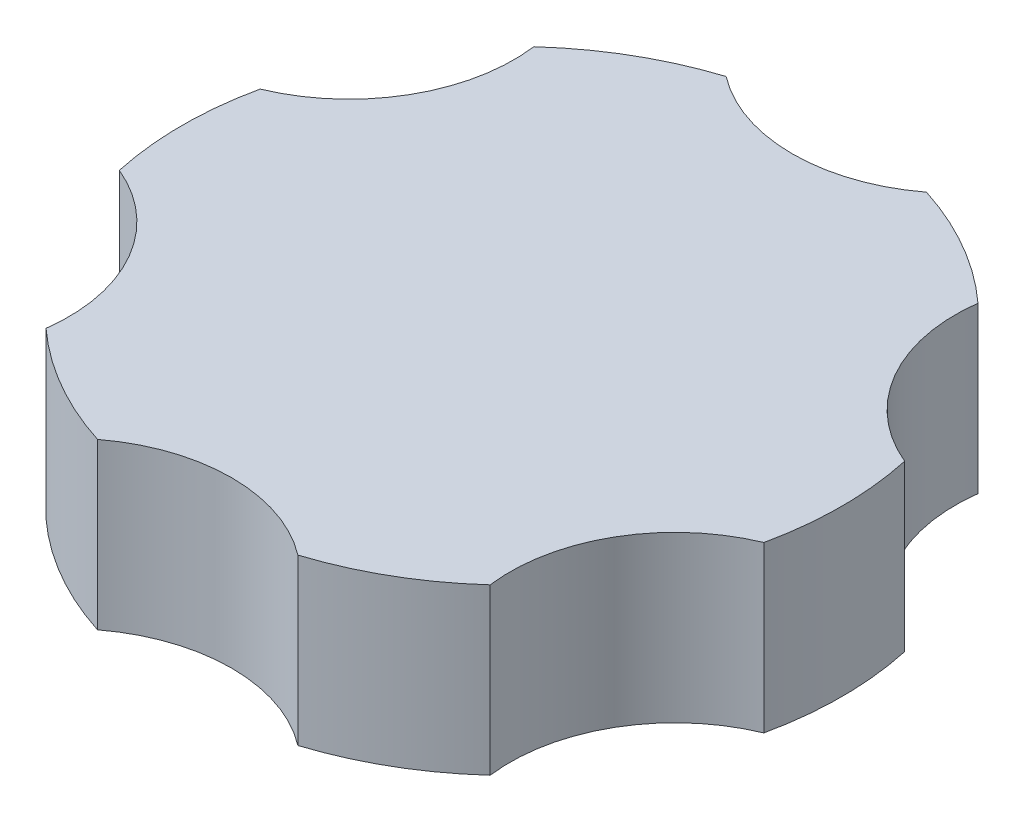
ISO-10303-21;
HEADER;
FILE_DESCRIPTION(('STEP AP214'),'2;1');
FILE_NAME('part.step','',(''),(''),'','','');
FILE_SCHEMA(('AUTOMOTIVE_DESIGN { 1 0 10303 214 1 1 1 1 }'));
ENDSEC;
DATA;
#1=APPLICATION_CONTEXT('core data for automotive mechanical design processes');
#2=APPLICATION_PROTOCOL_DEFINITION('international standard','automotive_design',2000,#1);
#3=PRODUCT_CONTEXT('',#1,'mechanical');
#4=PRODUCT('Part','Part','',(#3));
#5=PRODUCT_RELATED_PRODUCT_CATEGORY('part','',(#4));
#6=PRODUCT_DEFINITION_FORMATION('','',#4);
#7=PRODUCT_DEFINITION_CONTEXT('part definition',#1,'design');
#8=PRODUCT_DEFINITION('design','',#6,#7);
#9=PRODUCT_DEFINITION_SHAPE('','',#8);
#10=(LENGTH_UNIT() NAMED_UNIT(*) SI_UNIT(.MILLI.,.METRE.));
#11=(NAMED_UNIT(*) PLANE_ANGLE_UNIT() SI_UNIT($,.RADIAN.));
#12=(NAMED_UNIT(*) SI_UNIT($,.STERADIAN.) SOLID_ANGLE_UNIT());
#13=UNCERTAINTY_MEASURE_WITH_UNIT(LENGTH_MEASURE(1.E-05),#10,'distance_accuracy_value','');
#14=(GEOMETRIC_REPRESENTATION_CONTEXT(3) GLOBAL_UNCERTAINTY_ASSIGNED_CONTEXT((#13)) GLOBAL_UNIT_ASSIGNED_CONTEXT((#10,
#11,#12)) REPRESENTATION_CONTEXT('',''));
#15=CARTESIAN_POINT('',(0.,0.,0.));
#16=DIRECTION('',(0.,0.,1.));
#17=DIRECTION('',(1.,0.,0.));
#18=AXIS2_PLACEMENT_3D('',#15,#16,#17);
#19=CARTESIAN_POINT('',(0.,10.,0.));
#20=DIRECTION('',(0.,-1.,0.));
#21=DIRECTION('',(0.,0.,-1.));
#22=AXIS2_PLACEMENT_3D('',#19,#20,#21);
#23=CYLINDRICAL_SURFACE('',#22,20.);
#24=CARTESIAN_POINT('',(0.,0.,0.));
#25=DIRECTION('',(0.,1.,0.));
#26=DIRECTION('',(0.,0.,1.));
#27=AXIS2_PLACEMENT_3D('',#24,#25,#26);
#28=CIRCLE('',#27,20.);
#29=CARTESIAN_POINT('',(-19.5392793427599,0.,-4.26808654616994));
#30=VERTEX_POINT('',#29);
#31=CARTESIAN_POINT('',(-19.5392793427599,0.,4.26808654617008));
#32=VERTEX_POINT('',#31);
#33=EDGE_CURVE('E269',#30,#32,#28,.T.);
#34=ORIENTED_EDGE('',*,*,#33,.T.);
#35=DIRECTION('',(0.,1.,0.));
#36=VECTOR('',#35,1.);
#37=CARTESIAN_POINT('',(-19.5392793427599,5.,4.26808654617008));
#38=LINE('',#37,#36);
#39=CARTESIAN_POINT('',(-19.5392793427599,10.,4.26808654617008));
#40=VERTEX_POINT('',#39);
#41=EDGE_CURVE('E247',#32,#40,#38,.T.);
#42=ORIENTED_EDGE('',*,*,#41,.T.);
#43=CARTESIAN_POINT('',(0.,10.,0.));
#44=DIRECTION('',(0.,1.,0.));
#45=DIRECTION('',(0.,0.,1.));
#46=AXIS2_PLACEMENT_3D('',#43,#44,#45);
#47=CIRCLE('',#46,20.);
#48=CARTESIAN_POINT('',(-19.5392793427599,10.,-4.26808654616994));
#49=VERTEX_POINT('',#48);
#50=EDGE_CURVE('E264',#49,#40,#47,.T.);
#51=ORIENTED_EDGE('',*,*,#50,.F.);
#52=DIRECTION('',(0.,1.,0.));
#53=VECTOR('',#52,1.);
#54=CARTESIAN_POINT('',(-19.5392793427599,5.,-4.26808654616994));
#55=LINE('',#54,#53);
#56=EDGE_CURVE('E222',#49,#30,#55,.F.);
#57=ORIENTED_EDGE('',*,*,#56,.T.);
#58=EDGE_LOOP('',(#34,#42,#51,#57));
#59=FACE_BOUND('',#58,.T.);
#60=ADVANCED_FACE('F33',(#59),#23,.T.);
#61=CARTESIAN_POINT('',(-13.4659110459137,10.,14.7874690093856));
#62=VERTEX_POINT('',#61);
#63=CARTESIAN_POINT('',(-6.07336829684614,10.,19.0555555555555));
#64=VERTEX_POINT('',#63);
#65=EDGE_CURVE('E322',#62,#64,#47,.T.);
#66=ORIENTED_EDGE('',*,*,#65,.F.);
#67=DIRECTION('',(0.,1.,0.));
#68=VECTOR('',#67,1.);
#69=CARTESIAN_POINT('',(-13.4659110459137,5.,14.7874690093856));
#70=LINE('',#69,#68);
#71=CARTESIAN_POINT('',(-13.4659110459137,0.,14.7874690093856));
#72=VERTEX_POINT('',#71);
#73=EDGE_CURVE('E244',#62,#72,#70,.F.);
#74=ORIENTED_EDGE('',*,*,#73,.T.);
#75=CARTESIAN_POINT('',(-6.07336829684614,0.,19.0555555555556));
#76=VERTEX_POINT('',#75);
#77=EDGE_CURVE('E285',#72,#76,#28,.T.);
#78=ORIENTED_EDGE('',*,*,#77,.T.);
#79=DIRECTION('',(0.,1.,0.));
#80=VECTOR('',#79,1.);
#81=CARTESIAN_POINT('',(-6.07336829684614,5.,19.0555555555555));
#82=LINE('',#81,#80);
#83=EDGE_CURVE('E241',#76,#64,#82,.T.);
#84=ORIENTED_EDGE('',*,*,#83,.T.);
#85=EDGE_LOOP('',(#66,#74,#78,#84));
#86=FACE_BOUND('',#85,.T.);
#87=ADVANCED_FACE('F291',(#86),#23,.T.);
#88=CARTESIAN_POINT('',(6.07336829684614,10.,19.0555555555555));
#89=VERTEX_POINT('',#88);
#90=CARTESIAN_POINT('',(13.4659110459139,10.,14.7874690093854));
#91=VERTEX_POINT('',#90);
#92=EDGE_CURVE('E318',#89,#91,#47,.T.);
#93=ORIENTED_EDGE('',*,*,#92,.F.);
#94=DIRECTION('',(0.,1.,0.));
#95=VECTOR('',#94,1.);
#96=CARTESIAN_POINT('',(6.07336829684614,5.,19.0555555555555));
#97=LINE('',#96,#95);
#98=CARTESIAN_POINT('',(6.07336829684614,0.,19.0555555555555));
#99=VERTEX_POINT('',#98);
#100=EDGE_CURVE('E238',#89,#99,#97,.F.);
#101=ORIENTED_EDGE('',*,*,#100,.T.);
#102=CARTESIAN_POINT('',(13.4659110459139,0.,14.7874690093854));
#103=VERTEX_POINT('',#102);
#104=EDGE_CURVE('E287',#99,#103,#28,.T.);
#105=ORIENTED_EDGE('',*,*,#104,.T.);
#106=DIRECTION('',(0.,1.,0.));
#107=VECTOR('',#106,1.);
#108=CARTESIAN_POINT('',(13.4659110459139,5.,14.7874690093854));
#109=LINE('',#108,#107);
#110=EDGE_CURVE('E235',#103,#91,#109,.T.);
#111=ORIENTED_EDGE('',*,*,#110,.T.);
#112=EDGE_LOOP('',(#93,#101,#105,#111));
#113=FACE_BOUND('',#112,.T.);
#114=ADVANCED_FACE('F345',(#113),#23,.T.);
#115=CARTESIAN_POINT('',(19.5392793427599,10.,4.2680865461698));
#116=VERTEX_POINT('',#115);
#117=CARTESIAN_POINT('',(19.5392793427598,10.,-4.26808654617021));
#118=VERTEX_POINT('',#117);
#119=EDGE_CURVE('E317',#116,#118,#47,.T.);
#120=ORIENTED_EDGE('',*,*,#119,.F.);
#121=DIRECTION('',(0.,1.,0.));
#122=VECTOR('',#121,1.);
#123=CARTESIAN_POINT('',(19.5392793427599,5.,4.2680865461698));
#124=LINE('',#123,#122);
#125=CARTESIAN_POINT('',(19.5392793427599,0.,4.2680865461698));
#126=VERTEX_POINT('',#125);
#127=EDGE_CURVE('E232',#116,#126,#124,.F.);
#128=ORIENTED_EDGE('',*,*,#127,.T.);
#129=CARTESIAN_POINT('',(19.5392793427598,0.,-4.26808654617022));
#130=VERTEX_POINT('',#129);
#131=EDGE_CURVE('E294',#126,#130,#28,.T.);
#132=ORIENTED_EDGE('',*,*,#131,.T.);
#133=DIRECTION('',(0.,1.,0.));
#134=VECTOR('',#133,1.);
#135=CARTESIAN_POINT('',(19.5392793427598,5.,-4.26808654617021));
#136=LINE('',#135,#134);
#137=EDGE_CURVE('E56',#130,#118,#136,.T.);
#138=ORIENTED_EDGE('',*,*,#137,.T.);
#139=EDGE_LOOP('',(#120,#128,#132,#138));
#140=FACE_BOUND('',#139,.T.);
#141=ADVANCED_FACE('F352',(#140),#23,.T.);
#142=CARTESIAN_POINT('',(-6.07336829684614,0.,-19.0555555555555));
#143=VERTEX_POINT('',#142);
#144=CARTESIAN_POINT('',(-13.4659110459138,0.,-14.7874690093855));
#145=VERTEX_POINT('',#144);
#146=EDGE_CURVE('E266',#143,#145,#28,.T.);
#147=ORIENTED_EDGE('',*,*,#146,.T.);
#148=DIRECTION('',(0.,1.,0.));
#149=VECTOR('',#148,1.);
#150=CARTESIAN_POINT('',(-13.4659110459138,5.,-14.7874690093855));
#151=LINE('',#150,#149);
#152=CARTESIAN_POINT('',(-13.4659110459138,10.,-14.7874690093855));
#153=VERTEX_POINT('',#152);
#154=EDGE_CURVE('E225',#145,#153,#151,.T.);
#155=ORIENTED_EDGE('',*,*,#154,.T.);
#156=CARTESIAN_POINT('',(-6.07336829684614,10.,-19.0555555555555));
#157=VERTEX_POINT('',#156);
#158=EDGE_CURVE('E260',#157,#153,#47,.T.);
#159=ORIENTED_EDGE('',*,*,#158,.F.);
#160=DIRECTION('',(0.,1.,0.));
#161=VECTOR('',#160,1.);
#162=CARTESIAN_POINT('',(-6.07336829684614,5.,-19.0555555555555));
#163=LINE('',#162,#161);
#164=EDGE_CURVE('E253',#157,#143,#163,.F.);
#165=ORIENTED_EDGE('',*,*,#164,.T.);
#166=EDGE_LOOP('',(#147,#155,#159,#165));
#167=FACE_BOUND('',#166,.T.);
#168=ADVANCED_FACE('F309',(#167),#23,.T.);
#169=CARTESIAN_POINT('',(13.4659110459136,10.,-14.7874690093857));
#170=VERTEX_POINT('',#169);
#171=CARTESIAN_POINT('',(6.07336829684614,10.,-19.0555555555555));
#172=VERTEX_POINT('',#171);
#173=EDGE_CURVE('E265',#170,#172,#47,.T.);
#174=ORIENTED_EDGE('',*,*,#173,.F.);
#175=DIRECTION('',(0.,1.,0.));
#176=VECTOR('',#175,1.);
#177=CARTESIAN_POINT('',(13.4659110459136,5.,-14.7874690093857));
#178=LINE('',#177,#176);
#179=CARTESIAN_POINT('',(13.4659110459136,0.,-14.7874690093857));
#180=VERTEX_POINT('',#179);
#181=EDGE_CURVE('E228',#170,#180,#178,.F.);
#182=ORIENTED_EDGE('',*,*,#181,.T.);
#183=CARTESIAN_POINT('',(6.07336829684614,0.,-19.0555555555556));
#184=VERTEX_POINT('',#183);
#185=EDGE_CURVE('E259',#180,#184,#28,.T.);
#186=ORIENTED_EDGE('',*,*,#185,.T.);
#187=DIRECTION('',(0.,1.,0.));
#188=VECTOR('',#187,1.);
#189=CARTESIAN_POINT('',(6.07336829684614,5.,-19.0555555555555));
#190=LINE('',#189,#188);
#191=EDGE_CURVE('E256',#184,#172,#190,.T.);
#192=ORIENTED_EDGE('',*,*,#191,.T.);
#193=EDGE_LOOP('',(#174,#182,#186,#192));
#194=FACE_BOUND('',#193,.T.);
#195=ADVANCED_FACE('F35',(#194),#23,.T.);
#196=CARTESIAN_POINT('',(0.,10.,0.));
#197=DIRECTION('',(0.,1.,0.));
#198=DIRECTION('',(0.,0.,1.));
#199=AXIS2_PLACEMENT_3D('',#196,#197,#198);
#200=PLANE('',#199);
#201=CARTESIAN_POINT('',(-23.3826859021798,10.,13.5000000000001));
#202=DIRECTION('',(0.,1.,0.));
#203=DIRECTION('',(0.866025403784436,0.,-0.500000000000004));
#204=AXIS2_PLACEMENT_3D('',#201,#202,#203);
#205=CIRCLE('',#204,10.);
#206=EDGE_CURVE('E213',#62,#40,#205,.T.);
#207=ORIENTED_EDGE('',*,*,#206,.F.);
#208=ORIENTED_EDGE('',*,*,#65,.T.);
#209=CARTESIAN_POINT('',(0.,10.,27.));
#210=DIRECTION('',(0.,1.,0.));
#211=DIRECTION('',(0.,0.,-1.));
#212=AXIS2_PLACEMENT_3D('',#209,#210,#211);
#213=CIRCLE('',#212,10.);
#214=EDGE_CURVE('E216',#89,#64,#213,.T.);
#215=ORIENTED_EDGE('',*,*,#214,.F.);
#216=ORIENTED_EDGE('',*,*,#92,.T.);
#217=CARTESIAN_POINT('',(23.38268590218,10.,13.4999999999998));
#218=DIRECTION('',(0.,1.,0.));
#219=DIRECTION('',(-0.866025403784443,0.,-0.499999999999992));
#220=AXIS2_PLACEMENT_3D('',#217,#218,#219);
#221=CIRCLE('',#220,10.);
#222=EDGE_CURVE('E218',#116,#91,#221,.T.);
#223=ORIENTED_EDGE('',*,*,#222,.F.);
#224=ORIENTED_EDGE('',*,*,#119,.T.);
#225=CARTESIAN_POINT('',(23.3826859021797,10.,-13.5000000000003));
#226=DIRECTION('',(0.,1.,0.));
#227=DIRECTION('',(-0.866025403784433,0.,0.50000000000001));
#228=AXIS2_PLACEMENT_3D('',#225,#226,#227);
#229=CIRCLE('',#228,10.);
#230=EDGE_CURVE('E205',#170,#118,#229,.T.);
#231=ORIENTED_EDGE('',*,*,#230,.F.);
#232=ORIENTED_EDGE('',*,*,#173,.T.);
#233=CARTESIAN_POINT('',(0.,10.,-27.));
#234=DIRECTION('',(0.,1.,0.));
#235=DIRECTION('',(0.,0.,1.));
#236=AXIS2_PLACEMENT_3D('',#233,#234,#235);
#237=CIRCLE('',#236,10.);
#238=EDGE_CURVE('E250',#157,#172,#237,.T.);
#239=ORIENTED_EDGE('',*,*,#238,.F.);
#240=ORIENTED_EDGE('',*,*,#158,.T.);
#241=CARTESIAN_POINT('',(-23.3826859021799,10.,-13.4999999999999));
#242=DIRECTION('',(0.,1.,0.));
#243=DIRECTION('',(0.86602540378444,0.,0.499999999999998));
#244=AXIS2_PLACEMENT_3D('',#241,#242,#243);
#245=CIRCLE('',#244,10.);
#246=EDGE_CURVE('E215',#49,#153,#245,.T.);
#247=ORIENTED_EDGE('',*,*,#246,.F.);
#248=ORIENTED_EDGE('',*,*,#50,.T.);
#249=EDGE_LOOP('',(#207,#208,#215,#216,#223,#224,#231,#232,#239,#240,#247,#248));
#250=FACE_BOUND('',#249,.T.);
#251=ADVANCED_FACE('F313',(#250),#200,.T.);
#252=CARTESIAN_POINT('',(0.,0.,0.));
#253=DIRECTION('',(0.,1.,0.));
#254=DIRECTION('',(0.,0.,1.));
#255=AXIS2_PLACEMENT_3D('',#252,#253,#254);
#256=PLANE('',#255);
#257=DIRECTION('',(-0.866025403784438,0.,-0.5));
#258=VECTOR('',#257,1.);
#259=CARTESIAN_POINT('',(0.,0.,2.));
#260=LINE('',#259,#258);
#261=CARTESIAN_POINT('',(0.,0.,2.));
#262=VERTEX_POINT('',#261);
#263=CARTESIAN_POINT('',(-1.73205080756888,0.,1.));
#264=VERTEX_POINT('',#263);
#265=EDGE_CURVE('E193',#262,#264,#260,.T.);
#266=ORIENTED_EDGE('',*,*,#265,.F.);
#267=DIRECTION('',(-0.866025403784439,0.,0.5));
#268=VECTOR('',#267,1.);
#269=CARTESIAN_POINT('',(1.73205080756888,0.,1.));
#270=LINE('',#269,#268);
#271=CARTESIAN_POINT('',(1.73205080756888,0.,1.));
#272=VERTEX_POINT('',#271);
#273=EDGE_CURVE('E48',#272,#262,#270,.T.);
#274=ORIENTED_EDGE('',*,*,#273,.F.);
#275=DIRECTION('',(0.,0.,1.));
#276=VECTOR('',#275,1.);
#277=CARTESIAN_POINT('',(1.73205080756888,0.,-1.));
#278=LINE('',#277,#276);
#279=CARTESIAN_POINT('',(1.73205080756888,0.,-1.));
#280=VERTEX_POINT('',#279);
#281=EDGE_CURVE('E179',#280,#272,#278,.T.);
#282=ORIENTED_EDGE('',*,*,#281,.F.);
#283=DIRECTION('',(0.866025403784439,0.,0.5));
#284=VECTOR('',#283,1.);
#285=CARTESIAN_POINT('',(0.,0.,-2.));
#286=LINE('',#285,#284);
#287=CARTESIAN_POINT('',(0.,0.,-2.));
#288=VERTEX_POINT('',#287);
#289=EDGE_CURVE('E182',#288,#280,#286,.T.);
#290=ORIENTED_EDGE('',*,*,#289,.F.);
#291=DIRECTION('',(0.866025403784439,0.,-0.5));
#292=VECTOR('',#291,1.);
#293=CARTESIAN_POINT('',(-1.73205080756888,0.,-1.));
#294=LINE('',#293,#292);
#295=CARTESIAN_POINT('',(-1.73205080756888,0.,-1.));
#296=VERTEX_POINT('',#295);
#297=EDGE_CURVE('E198',#296,#288,#294,.T.);
#298=ORIENTED_EDGE('',*,*,#297,.F.);
#299=DIRECTION('',(0.,0.,-1.));
#300=VECTOR('',#299,1.);
#301=CARTESIAN_POINT('',(-1.73205080756888,0.,1.));
#302=LINE('',#301,#300);
#303=EDGE_CURVE('E195',#264,#296,#302,.T.);
#304=ORIENTED_EDGE('',*,*,#303,.F.);
#305=EDGE_LOOP('',(#266,#274,#282,#290,#298,#304));
#306=FACE_BOUND('',#305,.T.);
#307=ORIENTED_EDGE('',*,*,#77,.F.);
#308=CARTESIAN_POINT('',(-23.3826859021798,0.,13.5000000000001));
#309=DIRECTION('',(0.,1.,0.));
#310=DIRECTION('',(0.,0.,1.));
#311=AXIS2_PLACEMENT_3D('',#308,#309,#310);
#312=CIRCLE('',#311,10.);
#313=EDGE_CURVE('E11',#72,#32,#312,.T.);
#314=ORIENTED_EDGE('',*,*,#313,.T.);
#315=ORIENTED_EDGE('',*,*,#33,.F.);
#316=CARTESIAN_POINT('',(-23.3826859021799,0.,-13.4999999999999));
#317=DIRECTION('',(0.,1.,0.));
#318=DIRECTION('',(0.,0.,1.));
#319=AXIS2_PLACEMENT_3D('',#316,#317,#318);
#320=CIRCLE('',#319,10.);
#321=EDGE_CURVE('E272',#30,#145,#320,.T.);
#322=ORIENTED_EDGE('',*,*,#321,.T.);
#323=ORIENTED_EDGE('',*,*,#146,.F.);
#324=CARTESIAN_POINT('',(0.,0.,-27.));
#325=DIRECTION('',(0.,1.,0.));
#326=DIRECTION('',(0.,0.,1.));
#327=AXIS2_PLACEMENT_3D('',#324,#325,#326);
#328=CIRCLE('',#327,10.);
#329=EDGE_CURVE('E263',#143,#184,#328,.T.);
#330=ORIENTED_EDGE('',*,*,#329,.T.);
#331=ORIENTED_EDGE('',*,*,#185,.F.);
#332=CARTESIAN_POINT('',(23.3826859021797,0.,-13.5000000000003));
#333=DIRECTION('',(0.,1.,0.));
#334=DIRECTION('',(0.,0.,1.));
#335=AXIS2_PLACEMENT_3D('',#332,#333,#334);
#336=CIRCLE('',#335,10.);
#337=EDGE_CURVE('E275',#180,#130,#336,.T.);
#338=ORIENTED_EDGE('',*,*,#337,.T.);
#339=ORIENTED_EDGE('',*,*,#131,.F.);
#340=CARTESIAN_POINT('',(23.38268590218,0.,13.4999999999998));
#341=DIRECTION('',(0.,1.,0.));
#342=DIRECTION('',(0.,0.,1.));
#343=AXIS2_PLACEMENT_3D('',#340,#341,#342);
#344=CIRCLE('',#343,10.);
#345=EDGE_CURVE('E277',#126,#103,#344,.T.);
#346=ORIENTED_EDGE('',*,*,#345,.T.);
#347=ORIENTED_EDGE('',*,*,#104,.F.);
#348=CARTESIAN_POINT('',(0.,0.,27.));
#349=DIRECTION('',(0.,1.,0.));
#350=DIRECTION('',(0.,0.,1.));
#351=AXIS2_PLACEMENT_3D('',#348,#349,#350);
#352=CIRCLE('',#351,10.);
#353=EDGE_CURVE('E41',#99,#76,#352,.T.);
#354=ORIENTED_EDGE('',*,*,#353,.T.);
#355=EDGE_LOOP('',(#307,#314,#315,#322,#323,#330,#331,#338,#339,#346,#347,#354));
#356=FACE_BOUND('',#355,.T.);
#357=ADVANCED_FACE('F284',(#306,#356),#256,.F.);
#358=CARTESIAN_POINT('',(0.,0.,-27.));
#359=DIRECTION('',(0.,1.,0.));
#360=DIRECTION('',(0.,0.,1.));
#361=AXIS2_PLACEMENT_3D('',#358,#359,#360);
#362=CYLINDRICAL_SURFACE('',#361,10.);
#363=ORIENTED_EDGE('',*,*,#329,.F.);
#364=ORIENTED_EDGE('',*,*,#164,.F.);
#365=ORIENTED_EDGE('',*,*,#238,.T.);
#366=ORIENTED_EDGE('',*,*,#191,.F.);
#367=EDGE_LOOP('',(#363,#364,#365,#366));
#368=FACE_BOUND('',#367,.T.);
#369=ADVANCED_FACE('F304',(#368),#362,.F.);
#370=CARTESIAN_POINT('',(-23.3826859021799,0.,-13.4999999999999));
#371=DIRECTION('',(0.,1.,0.));
#372=DIRECTION('',(0.,0.,1.));
#373=AXIS2_PLACEMENT_3D('',#370,#371,#372);
#374=CYLINDRICAL_SURFACE('',#373,10.);
#375=ORIENTED_EDGE('',*,*,#321,.F.);
#376=ORIENTED_EDGE('',*,*,#56,.F.);
#377=ORIENTED_EDGE('',*,*,#246,.T.);
#378=ORIENTED_EDGE('',*,*,#154,.F.);
#379=EDGE_LOOP('',(#375,#376,#377,#378));
#380=FACE_BOUND('',#379,.T.);
#381=ADVANCED_FACE('F362',(#380),#374,.F.);
#382=CARTESIAN_POINT('',(23.3826859021797,0.,-13.5000000000003));
#383=DIRECTION('',(0.,1.,0.));
#384=DIRECTION('',(0.,0.,1.));
#385=AXIS2_PLACEMENT_3D('',#382,#383,#384);
#386=CYLINDRICAL_SURFACE('',#385,10.);
#387=ORIENTED_EDGE('',*,*,#337,.F.);
#388=ORIENTED_EDGE('',*,*,#181,.F.);
#389=ORIENTED_EDGE('',*,*,#230,.T.);
#390=ORIENTED_EDGE('',*,*,#137,.F.);
#391=EDGE_LOOP('',(#387,#388,#389,#390));
#392=FACE_BOUND('',#391,.T.);
#393=ADVANCED_FACE('F360',(#392),#386,.F.);
#394=CARTESIAN_POINT('',(23.38268590218,0.,13.4999999999998));
#395=DIRECTION('',(0.,1.,0.));
#396=DIRECTION('',(0.,0.,1.));
#397=AXIS2_PLACEMENT_3D('',#394,#395,#396);
#398=CYLINDRICAL_SURFACE('',#397,10.);
#399=ORIENTED_EDGE('',*,*,#345,.F.);
#400=ORIENTED_EDGE('',*,*,#127,.F.);
#401=ORIENTED_EDGE('',*,*,#222,.T.);
#402=ORIENTED_EDGE('',*,*,#110,.F.);
#403=EDGE_LOOP('',(#399,#400,#401,#402));
#404=FACE_BOUND('',#403,.T.);
#405=ADVANCED_FACE('F339',(#404),#398,.F.);
#406=CARTESIAN_POINT('',(0.,0.,27.));
#407=DIRECTION('',(0.,1.,0.));
#408=DIRECTION('',(0.,0.,1.));
#409=AXIS2_PLACEMENT_3D('',#406,#407,#408);
#410=CYLINDRICAL_SURFACE('',#409,10.);
#411=ORIENTED_EDGE('',*,*,#353,.F.);
#412=ORIENTED_EDGE('',*,*,#100,.F.);
#413=ORIENTED_EDGE('',*,*,#214,.T.);
#414=ORIENTED_EDGE('',*,*,#83,.F.);
#415=EDGE_LOOP('',(#411,#412,#413,#414));
#416=FACE_BOUND('',#415,.T.);
#417=ADVANCED_FACE('F331',(#416),#410,.F.);
#418=CARTESIAN_POINT('',(-23.3826859021798,0.,13.5000000000001));
#419=DIRECTION('',(0.,1.,0.));
#420=DIRECTION('',(0.,0.,1.));
#421=AXIS2_PLACEMENT_3D('',#418,#419,#420);
#422=CYLINDRICAL_SURFACE('',#421,10.);
#423=ORIENTED_EDGE('',*,*,#313,.F.);
#424=ORIENTED_EDGE('',*,*,#73,.F.);
#425=ORIENTED_EDGE('',*,*,#206,.T.);
#426=ORIENTED_EDGE('',*,*,#41,.F.);
#427=EDGE_LOOP('',(#423,#424,#425,#426));
#428=FACE_BOUND('',#427,.T.);
#429=ADVANCED_FACE('F329',(#428),#422,.F.);
#430=CARTESIAN_POINT('',(1.73205080756888,6.,1.));
#431=DIRECTION('',(0.5,0.,0.866025403784439));
#432=DIRECTION('',(0.866025403784439,0.,-0.5));
#433=AXIS2_PLACEMENT_3D('',#430,#431,#432);
#434=PLANE('',#433);
#435=ORIENTED_EDGE('',*,*,#273,.T.);
#436=DIRECTION('',(0.,-1.,0.));
#437=VECTOR('',#436,1.);
#438=CARTESIAN_POINT('',(0.,6.,2.));
#439=LINE('',#438,#437);
#440=CARTESIAN_POINT('',(0.,6.,2.));
#441=VERTEX_POINT('',#440);
#442=EDGE_CURVE('E156',#441,#262,#439,.T.);
#443=ORIENTED_EDGE('',*,*,#442,.F.);
#444=DIRECTION('',(-0.866025403784439,0.,0.5));
#445=VECTOR('',#444,1.);
#446=CARTESIAN_POINT('',(1.73205080756888,6.,1.));
#447=LINE('',#446,#445);
#448=CARTESIAN_POINT('',(1.73205080756888,6.,1.));
#449=VERTEX_POINT('',#448);
#450=EDGE_CURVE('E160',#449,#441,#447,.T.);
#451=ORIENTED_EDGE('',*,*,#450,.F.);
#452=DIRECTION('',(0.,-1.,0.));
#453=VECTOR('',#452,1.);
#454=CARTESIAN_POINT('',(1.73205080756888,6.,1.));
#455=LINE('',#454,#453);
#456=EDGE_CURVE('E203',#449,#272,#455,.T.);
#457=ORIENTED_EDGE('',*,*,#456,.T.);
#458=EDGE_LOOP('',(#435,#443,#451,#457));
#459=FACE_BOUND('',#458,.T.);
#460=ADVANCED_FACE('F158',(#459),#434,.F.);
#461=CARTESIAN_POINT('',(1.73205080756888,6.,-1.));
#462=DIRECTION('',(1.,0.,0.));
#463=DIRECTION('',(0.,0.,-1.));
#464=AXIS2_PLACEMENT_3D('',#461,#462,#463);
#465=PLANE('',#464);
#466=ORIENTED_EDGE('',*,*,#281,.T.);
#467=ORIENTED_EDGE('',*,*,#456,.F.);
#468=DIRECTION('',(0.,0.,1.));
#469=VECTOR('',#468,1.);
#470=CARTESIAN_POINT('',(1.73205080756888,6.,-1.));
#471=LINE('',#470,#469);
#472=CARTESIAN_POINT('',(1.73205080756888,6.,-1.));
#473=VERTEX_POINT('',#472);
#474=EDGE_CURVE('E166',#473,#449,#471,.T.);
#475=ORIENTED_EDGE('',*,*,#474,.F.);
#476=DIRECTION('',(0.,-1.,0.));
#477=VECTOR('',#476,1.);
#478=CARTESIAN_POINT('',(1.73205080756888,6.,-1.));
#479=LINE('',#478,#477);
#480=EDGE_CURVE('E206',#473,#280,#479,.T.);
#481=ORIENTED_EDGE('',*,*,#480,.T.);
#482=EDGE_LOOP('',(#466,#467,#475,#481));
#483=FACE_BOUND('',#482,.T.);
#484=ADVANCED_FACE('F337',(#483),#465,.F.);
#485=CARTESIAN_POINT('',(0.,6.,-2.));
#486=DIRECTION('',(0.5,0.,-0.866025403784439));
#487=DIRECTION('',(-0.866025403784439,0.,-0.5));
#488=AXIS2_PLACEMENT_3D('',#485,#486,#487);
#489=PLANE('',#488);
#490=ORIENTED_EDGE('',*,*,#289,.T.);
#491=ORIENTED_EDGE('',*,*,#480,.F.);
#492=DIRECTION('',(0.866025403784439,0.,0.5));
#493=VECTOR('',#492,1.);
#494=CARTESIAN_POINT('',(0.,6.,-2.));
#495=LINE('',#494,#493);
#496=CARTESIAN_POINT('',(0.,6.,-2.));
#497=VERTEX_POINT('',#496);
#498=EDGE_CURVE('E189',#497,#473,#495,.T.);
#499=ORIENTED_EDGE('',*,*,#498,.F.);
#500=DIRECTION('',(0.,-1.,0.));
#501=VECTOR('',#500,1.);
#502=CARTESIAN_POINT('',(0.,6.,-2.));
#503=LINE('',#502,#501);
#504=EDGE_CURVE('E208',#497,#288,#503,.T.);
#505=ORIENTED_EDGE('',*,*,#504,.T.);
#506=EDGE_LOOP('',(#490,#491,#499,#505));
#507=FACE_BOUND('',#506,.T.);
#508=ADVANCED_FACE('F388',(#507),#489,.F.);
#509=CARTESIAN_POINT('',(-1.73205080756888,6.,-1.));
#510=DIRECTION('',(-0.5,0.,-0.866025403784439));
#511=DIRECTION('',(-0.866025403784439,0.,0.5));
#512=AXIS2_PLACEMENT_3D('',#509,#510,#511);
#513=PLANE('',#512);
#514=ORIENTED_EDGE('',*,*,#297,.T.);
#515=ORIENTED_EDGE('',*,*,#504,.F.);
#516=DIRECTION('',(0.866025403784439,0.,-0.5));
#517=VECTOR('',#516,1.);
#518=CARTESIAN_POINT('',(-1.73205080756888,6.,-1.));
#519=LINE('',#518,#517);
#520=CARTESIAN_POINT('',(-1.73205080756888,6.,-1.));
#521=VERTEX_POINT('',#520);
#522=EDGE_CURVE('E186',#521,#497,#519,.T.);
#523=ORIENTED_EDGE('',*,*,#522,.F.);
#524=DIRECTION('',(0.,-1.,0.));
#525=VECTOR('',#524,1.);
#526=CARTESIAN_POINT('',(-1.73205080756888,6.,-1.));
#527=LINE('',#526,#525);
#528=EDGE_CURVE('E210',#521,#296,#527,.T.);
#529=ORIENTED_EDGE('',*,*,#528,.T.);
#530=EDGE_LOOP('',(#514,#515,#523,#529));
#531=FACE_BOUND('',#530,.T.);
#532=ADVANCED_FACE('F386',(#531),#513,.F.);
#533=CARTESIAN_POINT('',(-1.73205080756888,6.,1.));
#534=DIRECTION('',(-1.,0.,0.));
#535=DIRECTION('',(0.,0.,1.));
#536=AXIS2_PLACEMENT_3D('',#533,#534,#535);
#537=PLANE('',#536);
#538=ORIENTED_EDGE('',*,*,#303,.T.);
#539=ORIENTED_EDGE('',*,*,#528,.F.);
#540=DIRECTION('',(0.,0.,-1.));
#541=VECTOR('',#540,1.);
#542=CARTESIAN_POINT('',(-1.73205080756888,6.,1.));
#543=LINE('',#542,#541);
#544=CARTESIAN_POINT('',(-1.73205080756888,6.,1.));
#545=VERTEX_POINT('',#544);
#546=EDGE_CURVE('E174',#545,#521,#543,.T.);
#547=ORIENTED_EDGE('',*,*,#546,.F.);
#548=DIRECTION('',(0.,-1.,0.));
#549=VECTOR('',#548,1.);
#550=CARTESIAN_POINT('',(-1.73205080756888,6.,1.));
#551=LINE('',#550,#549);
#552=EDGE_CURVE('E165',#545,#264,#551,.T.);
#553=ORIENTED_EDGE('',*,*,#552,.T.);
#554=EDGE_LOOP('',(#538,#539,#547,#553));
#555=FACE_BOUND('',#554,.T.);
#556=ADVANCED_FACE('F382',(#555),#537,.F.);
#557=CARTESIAN_POINT('',(0.,6.,2.));
#558=DIRECTION('',(-0.5,0.,0.866025403784438));
#559=DIRECTION('',(0.866025403784439,0.,0.5));
#560=AXIS2_PLACEMENT_3D('',#557,#558,#559);
#561=PLANE('',#560);
#562=ORIENTED_EDGE('',*,*,#265,.T.);
#563=ORIENTED_EDGE('',*,*,#552,.F.);
#564=DIRECTION('',(-0.866025403784438,0.,-0.5));
#565=VECTOR('',#564,1.);
#566=CARTESIAN_POINT('',(0.,6.,2.));
#567=LINE('',#566,#565);
#568=EDGE_CURVE('E169',#441,#545,#567,.T.);
#569=ORIENTED_EDGE('',*,*,#568,.F.);
#570=ORIENTED_EDGE('',*,*,#442,.T.);
#571=EDGE_LOOP('',(#562,#563,#569,#570));
#572=FACE_BOUND('',#571,.T.);
#573=ADVANCED_FACE('F170',(#572),#561,.F.);
#574=CARTESIAN_POINT('',(0.,6.,0.));
#575=DIRECTION('',(0.,-1.,0.));
#576=DIRECTION('',(0.,0.,-1.));
#577=AXIS2_PLACEMENT_3D('',#574,#575,#576);
#578=PLANE('',#577);
#579=ORIENTED_EDGE('',*,*,#450,.T.);
#580=ORIENTED_EDGE('',*,*,#568,.T.);
#581=ORIENTED_EDGE('',*,*,#546,.T.);
#582=ORIENTED_EDGE('',*,*,#522,.T.);
#583=ORIENTED_EDGE('',*,*,#498,.T.);
#584=ORIENTED_EDGE('',*,*,#474,.T.);
#585=EDGE_LOOP('',(#579,#580,#581,#582,#583,#584));
#586=FACE_BOUND('',#585,.T.);
#587=ADVANCED_FACE('F176',(#586),#578,.T.);
#588=CLOSED_SHELL('',(#60,#87,#114,#141,#168,#195,#251,#357,#369,#381,#393,#405,#417,#429,#460,
#484,#508,#532,#556,#573,#587));
#589=MANIFOLD_SOLID_BREP('B2',#588);
#590=ADVANCED_BREP_SHAPE_REPRESENTATION('',(#18,#589),#14);
#591=SHAPE_DEFINITION_REPRESENTATION(#9,#590);
ENDSEC;
END-ISO-10303-21;
